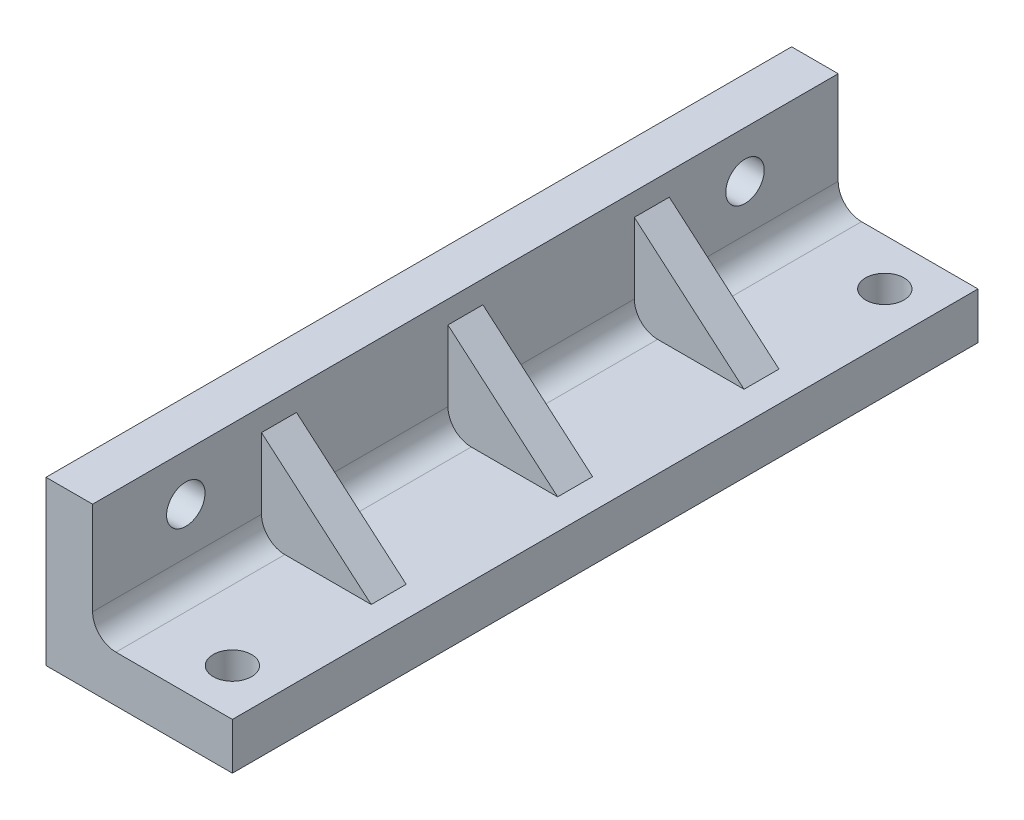
ISO-10303-21;
HEADER;
FILE_DESCRIPTION(('STEP AP214'),'2;1');
FILE_NAME('part.step','',(''),(''),'','','');
FILE_SCHEMA(('AUTOMOTIVE_DESIGN { 1 0 10303 214 1 1 1 1 }'));
ENDSEC;
DATA;
#1=APPLICATION_CONTEXT('core data for automotive mechanical design processes');
#2=APPLICATION_PROTOCOL_DEFINITION('international standard','automotive_design',2000,#1);
#3=PRODUCT_CONTEXT('',#1,'mechanical');
#4=PRODUCT('Part','Part','',(#3));
#5=PRODUCT_RELATED_PRODUCT_CATEGORY('part','',(#4));
#6=PRODUCT_DEFINITION_FORMATION('','',#4);
#7=PRODUCT_DEFINITION_CONTEXT('part definition',#1,'design');
#8=PRODUCT_DEFINITION('design','',#6,#7);
#9=PRODUCT_DEFINITION_SHAPE('','',#8);
#10=(LENGTH_UNIT() NAMED_UNIT(*) SI_UNIT(.MILLI.,.METRE.));
#11=(NAMED_UNIT(*) PLANE_ANGLE_UNIT() SI_UNIT($,.RADIAN.));
#12=(NAMED_UNIT(*) SI_UNIT($,.STERADIAN.) SOLID_ANGLE_UNIT());
#13=UNCERTAINTY_MEASURE_WITH_UNIT(LENGTH_MEASURE(1.E-05),#10,'distance_accuracy_value','');
#14=(GEOMETRIC_REPRESENTATION_CONTEXT(3) GLOBAL_UNCERTAINTY_ASSIGNED_CONTEXT((#13)) GLOBAL_UNIT_ASSIGNED_CONTEXT((#10,
#11,#12)) REPRESENTATION_CONTEXT('',''));
#15=CARTESIAN_POINT('',(0.,0.,0.));
#16=DIRECTION('',(0.,0.,1.));
#17=DIRECTION('',(1.,0.,0.));
#18=AXIS2_PLACEMENT_3D('',#15,#16,#17);
#19=CARTESIAN_POINT('',(6.,6.,32.));
#20=DIRECTION('',(0.,0.,1.));
#21=DIRECTION('',(1.,0.,0.));
#22=AXIS2_PLACEMENT_3D('',#19,#20,#21);
#23=CYLINDRICAL_SURFACE('',#22,2.);
#24=CARTESIAN_POINT('',(6.,6.,14.5));
#25=DIRECTION('',(0.,0.,1.));
#26=DIRECTION('',(1.,0.,0.));
#27=AXIS2_PLACEMENT_3D('',#24,#25,#26);
#28=CIRCLE('',#27,2.);
#29=CARTESIAN_POINT('',(6.,4.,14.5));
#30=VERTEX_POINT('',#29);
#31=CARTESIAN_POINT('',(4.,6.,14.5));
#32=VERTEX_POINT('',#31);
#33=EDGE_CURVE('E172',#30,#32,#28,.F.);
#34=ORIENTED_EDGE('',*,*,#33,.F.);
#35=DIRECTION('',(0.,0.,-1.));
#36=VECTOR('',#35,1.);
#37=CARTESIAN_POINT('',(6.,4.,32.));
#38=LINE('',#37,#36);
#39=CARTESIAN_POINT('',(6.,4.,1.5));
#40=VERTEX_POINT('',#39);
#41=EDGE_CURVE('E398',#40,#30,#38,.F.);
#42=ORIENTED_EDGE('',*,*,#41,.F.);
#43=CARTESIAN_POINT('',(6.,6.,1.5));
#44=DIRECTION('',(0.,0.,1.));
#45=DIRECTION('',(1.,0.,0.));
#46=AXIS2_PLACEMENT_3D('',#43,#44,#45);
#47=CIRCLE('',#46,2.);
#48=CARTESIAN_POINT('',(4.,6.,1.5));
#49=VERTEX_POINT('',#48);
#50=EDGE_CURVE('E174',#40,#49,#47,.F.);
#51=ORIENTED_EDGE('',*,*,#50,.T.);
#52=DIRECTION('',(0.,0.,-1.));
#53=VECTOR('',#52,1.);
#54=CARTESIAN_POINT('',(4.,6.,-32.));
#55=LINE('',#54,#53);
#56=EDGE_CURVE('E168',#32,#49,#55,.T.);
#57=ORIENTED_EDGE('',*,*,#56,.F.);
#58=EDGE_LOOP('',(#34,#42,#51,#57));
#59=FACE_BOUND('',#58,.T.);
#60=ADVANCED_FACE('F39',(#59),#23,.F.);
#61=CARTESIAN_POINT('',(6.,6.,-1.5));
#62=DIRECTION('',(0.,0.,1.));
#63=DIRECTION('',(1.,0.,0.));
#64=AXIS2_PLACEMENT_3D('',#61,#62,#63);
#65=CIRCLE('',#64,2.);
#66=CARTESIAN_POINT('',(6.,4.,-1.5));
#67=VERTEX_POINT('',#66);
#68=CARTESIAN_POINT('',(4.,6.,-1.5));
#69=VERTEX_POINT('',#68);
#70=EDGE_CURVE('E196',#67,#69,#65,.F.);
#71=ORIENTED_EDGE('',*,*,#70,.F.);
#72=CARTESIAN_POINT('',(6.,4.,-14.5));
#73=VERTEX_POINT('',#72);
#74=EDGE_CURVE('E214',#73,#67,#38,.F.);
#75=ORIENTED_EDGE('',*,*,#74,.F.);
#76=CARTESIAN_POINT('',(6.,6.,-14.5));
#77=DIRECTION('',(0.,0.,1.));
#78=DIRECTION('',(1.,0.,0.));
#79=AXIS2_PLACEMENT_3D('',#76,#77,#78);
#80=CIRCLE('',#79,2.);
#81=CARTESIAN_POINT('',(4.,6.,-14.5));
#82=VERTEX_POINT('',#81);
#83=EDGE_CURVE('E202',#73,#82,#80,.F.);
#84=ORIENTED_EDGE('',*,*,#83,.T.);
#85=EDGE_CURVE('E178',#69,#82,#55,.T.);
#86=ORIENTED_EDGE('',*,*,#85,.F.);
#87=EDGE_LOOP('',(#71,#75,#84,#86));
#88=FACE_BOUND('',#87,.T.);
#89=ADVANCED_FACE('F353',(#88),#23,.F.);
#90=CARTESIAN_POINT('',(6.,6.,-17.5));
#91=DIRECTION('',(0.,0.,1.));
#92=DIRECTION('',(1.,0.,0.));
#93=AXIS2_PLACEMENT_3D('',#90,#91,#92);
#94=CIRCLE('',#93,2.);
#95=CARTESIAN_POINT('',(6.,4.,-17.5));
#96=VERTEX_POINT('',#95);
#97=CARTESIAN_POINT('',(4.,6.,-17.5));
#98=VERTEX_POINT('',#97);
#99=EDGE_CURVE('E205',#96,#98,#94,.F.);
#100=ORIENTED_EDGE('',*,*,#99,.F.);
#101=CARTESIAN_POINT('',(6.,4.,-32.));
#102=VERTEX_POINT('',#101);
#103=EDGE_CURVE('E212',#102,#96,#38,.F.);
#104=ORIENTED_EDGE('',*,*,#103,.F.);
#105=CARTESIAN_POINT('',(6.,6.,-32.));
#106=DIRECTION('',(0.,0.,1.));
#107=DIRECTION('',(1.,0.,0.));
#108=AXIS2_PLACEMENT_3D('',#105,#106,#107);
#109=CIRCLE('',#108,2.);
#110=CARTESIAN_POINT('',(4.,6.,-32.));
#111=VERTEX_POINT('',#110);
#112=EDGE_CURVE('E210',#111,#102,#109,.T.);
#113=ORIENTED_EDGE('',*,*,#112,.F.);
#114=EDGE_CURVE('E217',#98,#111,#55,.T.);
#115=ORIENTED_EDGE('',*,*,#114,.F.);
#116=EDGE_LOOP('',(#100,#104,#113,#115));
#117=FACE_BOUND('',#116,.T.);
#118=ADVANCED_FACE('F357',(#117),#23,.F.);
#119=CARTESIAN_POINT('',(0.,14.,32.));
#120=DIRECTION('',(1.,0.,0.));
#121=DIRECTION('',(0.,0.,-1.));
#122=AXIS2_PLACEMENT_3D('',#119,#120,#121);
#123=PLANE('',#122);
#124=CARTESIAN_POINT('',(0.,10.,24.));
#125=DIRECTION('',(1.,0.,0.));
#126=DIRECTION('',(0.,0.,-1.));
#127=AXIS2_PLACEMENT_3D('',#124,#125,#126);
#128=CIRCLE('',#127,1.65);
#129=CARTESIAN_POINT('',(0.,10.,22.35));
#130=VERTEX_POINT('',#129);
#131=EDGE_CURVE('E226',#130,#130,#128,.T.);
#132=ORIENTED_EDGE('',*,*,#131,.T.);
#133=EDGE_LOOP('',(#132));
#134=FACE_BOUND('',#133,.T.);
#135=CARTESIAN_POINT('',(0.,10.,-24.));
#136=DIRECTION('',(1.,0.,0.));
#137=DIRECTION('',(0.,0.,-1.));
#138=AXIS2_PLACEMENT_3D('',#135,#136,#137);
#139=CIRCLE('',#138,1.65);
#140=CARTESIAN_POINT('',(0.,10.,-25.65));
#141=VERTEX_POINT('',#140);
#142=EDGE_CURVE('E234',#141,#141,#139,.T.);
#143=ORIENTED_EDGE('',*,*,#142,.T.);
#144=EDGE_LOOP('',(#143));
#145=FACE_BOUND('',#144,.T.);
#146=DIRECTION('',(0.,-1.,0.));
#147=VECTOR('',#146,1.);
#148=CARTESIAN_POINT('',(0.,14.,-32.));
#149=LINE('',#148,#147);
#150=CARTESIAN_POINT('',(0.,14.,-32.));
#151=VERTEX_POINT('',#150);
#152=CARTESIAN_POINT('',(0.,0.,-32.));
#153=VERTEX_POINT('',#152);
#154=EDGE_CURVE('E263',#151,#153,#149,.T.);
#155=ORIENTED_EDGE('',*,*,#154,.T.);
#156=DIRECTION('',(0.,0.,-1.));
#157=VECTOR('',#156,1.);
#158=CARTESIAN_POINT('',(0.,0.,32.));
#159=LINE('',#158,#157);
#160=CARTESIAN_POINT('',(0.,0.,32.));
#161=VERTEX_POINT('',#160);
#162=EDGE_CURVE('E235',#161,#153,#159,.T.);
#163=ORIENTED_EDGE('',*,*,#162,.F.);
#164=DIRECTION('',(0.,-1.,0.));
#165=VECTOR('',#164,1.);
#166=CARTESIAN_POINT('',(0.,14.,32.));
#167=LINE('',#166,#165);
#168=CARTESIAN_POINT('',(0.,14.,32.));
#169=VERTEX_POINT('',#168);
#170=EDGE_CURVE('E253',#169,#161,#167,.T.);
#171=ORIENTED_EDGE('',*,*,#170,.F.);
#172=DIRECTION('',(0.,0.,-1.));
#173=VECTOR('',#172,1.);
#174=CARTESIAN_POINT('',(0.,14.,32.));
#175=LINE('',#174,#173);
#176=EDGE_CURVE('E247',#169,#151,#175,.T.);
#177=ORIENTED_EDGE('',*,*,#176,.T.);
#178=EDGE_LOOP('',(#155,#163,#171,#177));
#179=FACE_BOUND('',#178,.T.);
#180=ADVANCED_FACE('F375',(#134,#145,#179),#123,.F.);
#181=CARTESIAN_POINT('',(0.,0.,32.));
#182=DIRECTION('',(0.,1.,0.));
#183=DIRECTION('',(0.,0.,1.));
#184=AXIS2_PLACEMENT_3D('',#181,#182,#183);
#185=PLANE('',#184);
#186=CARTESIAN_POINT('',(12.,0.,28.));
#187=DIRECTION('',(0.,1.,0.));
#188=DIRECTION('',(0.,0.,1.));
#189=AXIS2_PLACEMENT_3D('',#186,#187,#188);
#190=CIRCLE('',#189,1.65);
#191=CARTESIAN_POINT('',(12.,0.,29.65));
#192=VERTEX_POINT('',#191);
#193=EDGE_CURVE('E221',#192,#192,#190,.T.);
#194=ORIENTED_EDGE('',*,*,#193,.T.);
#195=EDGE_LOOP('',(#194));
#196=FACE_BOUND('',#195,.T.);
#197=CARTESIAN_POINT('',(12.,0.,-28.));
#198=DIRECTION('',(0.,1.,0.));
#199=DIRECTION('',(0.,0.,1.));
#200=AXIS2_PLACEMENT_3D('',#197,#198,#199);
#201=CIRCLE('',#200,1.65);
#202=CARTESIAN_POINT('',(12.,0.,-26.35));
#203=VERTEX_POINT('',#202);
#204=EDGE_CURVE('E230',#203,#203,#201,.T.);
#205=ORIENTED_EDGE('',*,*,#204,.T.);
#206=EDGE_LOOP('',(#205));
#207=FACE_BOUND('',#206,.T.);
#208=DIRECTION('',(1.,0.,0.));
#209=VECTOR('',#208,1.);
#210=CARTESIAN_POINT('',(0.,0.,-32.));
#211=LINE('',#210,#209);
#212=CARTESIAN_POINT('',(16.,0.,-32.));
#213=VERTEX_POINT('',#212);
#214=EDGE_CURVE('E261',#153,#213,#211,.T.);
#215=ORIENTED_EDGE('',*,*,#214,.T.);
#216=DIRECTION('',(0.,0.,-1.));
#217=VECTOR('',#216,1.);
#218=CARTESIAN_POINT('',(16.,0.,32.));
#219=LINE('',#218,#217);
#220=CARTESIAN_POINT('',(16.,0.,32.));
#221=VERTEX_POINT('',#220);
#222=EDGE_CURVE('E238',#221,#213,#219,.T.);
#223=ORIENTED_EDGE('',*,*,#222,.F.);
#224=DIRECTION('',(1.,0.,0.));
#225=VECTOR('',#224,1.);
#226=CARTESIAN_POINT('',(0.,0.,32.));
#227=LINE('',#226,#225);
#228=EDGE_CURVE('E274',#161,#221,#227,.T.);
#229=ORIENTED_EDGE('',*,*,#228,.F.);
#230=ORIENTED_EDGE('',*,*,#162,.T.);
#231=EDGE_LOOP('',(#215,#223,#229,#230));
#232=FACE_BOUND('',#231,.T.);
#233=ADVANCED_FACE('F380',(#196,#207,#232),#185,.F.);
#234=CARTESIAN_POINT('',(16.,0.,32.));
#235=DIRECTION('',(-1.,0.,0.));
#236=DIRECTION('',(0.,0.,1.));
#237=AXIS2_PLACEMENT_3D('',#234,#235,#236);
#238=PLANE('',#237);
#239=DIRECTION('',(0.,1.,0.));
#240=VECTOR('',#239,1.);
#241=CARTESIAN_POINT('',(16.,0.,-32.));
#242=LINE('',#241,#240);
#243=CARTESIAN_POINT('',(16.,4.,-32.));
#244=VERTEX_POINT('',#243);
#245=EDGE_CURVE('E259',#213,#244,#242,.T.);
#246=ORIENTED_EDGE('',*,*,#245,.T.);
#247=DIRECTION('',(0.,0.,-1.));
#248=VECTOR('',#247,1.);
#249=CARTESIAN_POINT('',(16.,4.,32.));
#250=LINE('',#249,#248);
#251=CARTESIAN_POINT('',(16.,4.,32.));
#252=VERTEX_POINT('',#251);
#253=EDGE_CURVE('E241',#252,#244,#250,.T.);
#254=ORIENTED_EDGE('',*,*,#253,.F.);
#255=DIRECTION('',(0.,1.,0.));
#256=VECTOR('',#255,1.);
#257=CARTESIAN_POINT('',(16.,0.,32.));
#258=LINE('',#257,#256);
#259=EDGE_CURVE('E272',#221,#252,#258,.T.);
#260=ORIENTED_EDGE('',*,*,#259,.F.);
#261=ORIENTED_EDGE('',*,*,#222,.T.);
#262=EDGE_LOOP('',(#246,#254,#260,#261));
#263=FACE_BOUND('',#262,.T.);
#264=ADVANCED_FACE('F421',(#263),#238,.F.);
#265=CARTESIAN_POINT('',(16.,4.,32.));
#266=DIRECTION('',(0.,-1.,0.));
#267=DIRECTION('',(0.,0.,-1.));
#268=AXIS2_PLACEMENT_3D('',#265,#266,#267);
#269=PLANE('',#268);
#270=CARTESIAN_POINT('',(12.,4.,28.));
#271=DIRECTION('',(0.,-1.,0.));
#272=DIRECTION('',(0.,0.,-1.));
#273=AXIS2_PLACEMENT_3D('',#270,#271,#272);
#274=CIRCLE('',#273,1.65);
#275=CARTESIAN_POINT('',(12.,4.,26.35));
#276=VERTEX_POINT('',#275);
#277=EDGE_CURVE('E218',#276,#276,#274,.T.);
#278=ORIENTED_EDGE('',*,*,#277,.T.);
#279=EDGE_LOOP('',(#278));
#280=FACE_BOUND('',#279,.T.);
#281=CARTESIAN_POINT('',(12.,4.,-28.));
#282=DIRECTION('',(0.,-1.,0.));
#283=DIRECTION('',(0.,0.,-1.));
#284=AXIS2_PLACEMENT_3D('',#281,#282,#283);
#285=CIRCLE('',#284,1.65);
#286=CARTESIAN_POINT('',(12.,4.,-29.65));
#287=VERTEX_POINT('',#286);
#288=EDGE_CURVE('E227',#287,#287,#285,.T.);
#289=ORIENTED_EDGE('',*,*,#288,.T.);
#290=EDGE_LOOP('',(#289));
#291=FACE_BOUND('',#290,.T.);
#292=DIRECTION('',(0.,0.,-1.));
#293=VECTOR('',#292,1.);
#294=CARTESIAN_POINT('',(13.4166666666667,4.,32.));
#295=LINE('',#294,#293);
#296=CARTESIAN_POINT('',(13.4166666666667,4.,17.5));
#297=VERTEX_POINT('',#296);
#298=CARTESIAN_POINT('',(13.4166666666667,4.,14.5));
#299=VERTEX_POINT('',#298);
#300=EDGE_CURVE('E54',#297,#299,#295,.T.);
#301=ORIENTED_EDGE('',*,*,#300,.F.);
#302=DIRECTION('',(-1.,0.,0.));
#303=VECTOR('',#302,1.);
#304=CARTESIAN_POINT('',(16.,4.,17.5));
#305=LINE('',#304,#303);
#306=CARTESIAN_POINT('',(6.,4.,17.5));
#307=VERTEX_POINT('',#306);
#308=EDGE_CURVE('E324',#297,#307,#305,.T.);
#309=ORIENTED_EDGE('',*,*,#308,.T.);
#310=CARTESIAN_POINT('',(6.,4.,32.));
#311=VERTEX_POINT('',#310);
#312=EDGE_CURVE('E215',#307,#311,#38,.F.);
#313=ORIENTED_EDGE('',*,*,#312,.T.);
#314=DIRECTION('',(-1.,0.,0.));
#315=VECTOR('',#314,1.);
#316=CARTESIAN_POINT('',(16.,4.,32.));
#317=LINE('',#316,#315);
#318=EDGE_CURVE('E269',#252,#311,#317,.T.);
#319=ORIENTED_EDGE('',*,*,#318,.F.);
#320=ORIENTED_EDGE('',*,*,#253,.T.);
#321=DIRECTION('',(-1.,0.,0.));
#322=VECTOR('',#321,1.);
#323=CARTESIAN_POINT('',(16.,4.,-32.));
#324=LINE('',#323,#322);
#325=EDGE_CURVE('E256',#244,#102,#324,.T.);
#326=ORIENTED_EDGE('',*,*,#325,.T.);
#327=ORIENTED_EDGE('',*,*,#103,.T.);
#328=DIRECTION('',(-1.,0.,0.));
#329=VECTOR('',#328,1.);
#330=CARTESIAN_POINT('',(16.,4.,-17.5));
#331=LINE('',#330,#329);
#332=CARTESIAN_POINT('',(13.4166666666667,4.,-17.5));
#333=VERTEX_POINT('',#332);
#334=EDGE_CURVE('E292',#333,#96,#331,.T.);
#335=ORIENTED_EDGE('',*,*,#334,.F.);
#336=DIRECTION('',(0.,0.,-1.));
#337=VECTOR('',#336,1.);
#338=CARTESIAN_POINT('',(13.4166666666667,4.,32.));
#339=LINE('',#338,#337);
#340=CARTESIAN_POINT('',(13.4166666666667,4.,-14.5));
#341=VERTEX_POINT('',#340);
#342=EDGE_CURVE('E222',#341,#333,#339,.T.);
#343=ORIENTED_EDGE('',*,*,#342,.F.);
#344=DIRECTION('',(-1.,0.,0.));
#345=VECTOR('',#344,1.);
#346=CARTESIAN_POINT('',(16.,4.,-14.5));
#347=LINE('',#346,#345);
#348=EDGE_CURVE('E288',#341,#73,#347,.T.);
#349=ORIENTED_EDGE('',*,*,#348,.T.);
#350=ORIENTED_EDGE('',*,*,#74,.T.);
#351=DIRECTION('',(-1.,0.,0.));
#352=VECTOR('',#351,1.);
#353=CARTESIAN_POINT('',(16.,4.,-1.5));
#354=LINE('',#353,#352);
#355=CARTESIAN_POINT('',(13.4166666666667,4.,-1.5));
#356=VERTEX_POINT('',#355);
#357=EDGE_CURVE('E311',#356,#67,#354,.T.);
#358=ORIENTED_EDGE('',*,*,#357,.F.);
#359=DIRECTION('',(0.,0.,-1.));
#360=VECTOR('',#359,1.);
#361=CARTESIAN_POINT('',(13.4166666666667,4.,32.));
#362=LINE('',#361,#360);
#363=CARTESIAN_POINT('',(13.4166666666667,4.,1.5));
#364=VERTEX_POINT('',#363);
#365=EDGE_CURVE('E302',#364,#356,#362,.T.);
#366=ORIENTED_EDGE('',*,*,#365,.F.);
#367=DIRECTION('',(-1.,0.,0.));
#368=VECTOR('',#367,1.);
#369=CARTESIAN_POINT('',(16.,4.,1.5));
#370=LINE('',#369,#368);
#371=EDGE_CURVE('E307',#364,#40,#370,.T.);
#372=ORIENTED_EDGE('',*,*,#371,.T.);
#373=ORIENTED_EDGE('',*,*,#41,.T.);
#374=DIRECTION('',(-1.,0.,0.));
#375=VECTOR('',#374,1.);
#376=CARTESIAN_POINT('',(16.,4.,14.5));
#377=LINE('',#376,#375);
#378=EDGE_CURVE('E59',#299,#30,#377,.T.);
#379=ORIENTED_EDGE('',*,*,#378,.F.);
#380=EDGE_LOOP('',(#301,#309,#313,#319,#320,#326,#327,#335,#343,#349,#350,#358,#366,#372,#373,#379));
#381=FACE_BOUND('',#380,.T.);
#382=ADVANCED_FACE('F386',(#280,#291,#381),#269,.F.);
#383=CARTESIAN_POINT('',(4.,4.,32.));
#384=DIRECTION('',(-1.,0.,0.));
#385=DIRECTION('',(0.,0.,1.));
#386=AXIS2_PLACEMENT_3D('',#383,#384,#385);
#387=PLANE('',#386);
#388=CARTESIAN_POINT('',(4.,10.,24.));
#389=DIRECTION('',(-1.,0.,0.));
#390=DIRECTION('',(0.,0.,1.));
#391=AXIS2_PLACEMENT_3D('',#388,#389,#390);
#392=CIRCLE('',#391,1.65);
#393=CARTESIAN_POINT('',(4.,10.,25.65));
#394=VERTEX_POINT('',#393);
#395=EDGE_CURVE('E223',#394,#394,#392,.T.);
#396=ORIENTED_EDGE('',*,*,#395,.T.);
#397=EDGE_LOOP('',(#396));
#398=FACE_BOUND('',#397,.T.);
#399=CARTESIAN_POINT('',(4.,10.,-24.));
#400=DIRECTION('',(-1.,0.,0.));
#401=DIRECTION('',(0.,0.,1.));
#402=AXIS2_PLACEMENT_3D('',#399,#400,#401);
#403=CIRCLE('',#402,1.65);
#404=CARTESIAN_POINT('',(4.,10.,-22.35));
#405=VERTEX_POINT('',#404);
#406=EDGE_CURVE('E231',#405,#405,#403,.T.);
#407=ORIENTED_EDGE('',*,*,#406,.T.);
#408=EDGE_LOOP('',(#407));
#409=FACE_BOUND('',#408,.T.);
#410=CARTESIAN_POINT('',(4.,6.,32.));
#411=VERTEX_POINT('',#410);
#412=CARTESIAN_POINT('',(4.,6.,17.5));
#413=VERTEX_POINT('',#412);
#414=EDGE_CURVE('E177',#411,#413,#55,.T.);
#415=ORIENTED_EDGE('',*,*,#414,.T.);
#416=DIRECTION('',(0.,1.,0.));
#417=VECTOR('',#416,1.);
#418=CARTESIAN_POINT('',(4.,4.,17.5));
#419=LINE('',#418,#417);
#420=CARTESIAN_POINT('',(4.,12.0714285714286,17.5));
#421=VERTEX_POINT('',#420);
#422=EDGE_CURVE('E326',#413,#421,#419,.T.);
#423=ORIENTED_EDGE('',*,*,#422,.T.);
#424=DIRECTION('',(0.,0.,1.));
#425=VECTOR('',#424,1.);
#426=CARTESIAN_POINT('',(4.,12.0714285714286,32.));
#427=LINE('',#426,#425);
#428=CARTESIAN_POINT('',(4.,12.0714285714286,14.5));
#429=VERTEX_POINT('',#428);
#430=EDGE_CURVE('E11',#429,#421,#427,.T.);
#431=ORIENTED_EDGE('',*,*,#430,.F.);
#432=DIRECTION('',(0.,1.,0.));
#433=VECTOR('',#432,1.);
#434=CARTESIAN_POINT('',(4.,4.,14.5));
#435=LINE('',#434,#433);
#436=EDGE_CURVE('E181',#32,#429,#435,.T.);
#437=ORIENTED_EDGE('',*,*,#436,.F.);
#438=ORIENTED_EDGE('',*,*,#56,.T.);
#439=DIRECTION('',(0.,1.,0.));
#440=VECTOR('',#439,1.);
#441=CARTESIAN_POINT('',(4.,4.,1.5));
#442=LINE('',#441,#440);
#443=CARTESIAN_POINT('',(4.,12.0714285714286,1.5));
#444=VERTEX_POINT('',#443);
#445=EDGE_CURVE('E309',#49,#444,#442,.T.);
#446=ORIENTED_EDGE('',*,*,#445,.T.);
#447=DIRECTION('',(0.,0.,1.));
#448=VECTOR('',#447,1.);
#449=CARTESIAN_POINT('',(4.,12.0714285714286,32.));
#450=LINE('',#449,#448);
#451=CARTESIAN_POINT('',(4.,12.0714285714286,-1.5));
#452=VERTEX_POINT('',#451);
#453=EDGE_CURVE('E190',#452,#444,#450,.T.);
#454=ORIENTED_EDGE('',*,*,#453,.F.);
#455=DIRECTION('',(0.,1.,0.));
#456=VECTOR('',#455,1.);
#457=CARTESIAN_POINT('',(4.,4.,-1.5));
#458=LINE('',#457,#456);
#459=EDGE_CURVE('E314',#69,#452,#458,.T.);
#460=ORIENTED_EDGE('',*,*,#459,.F.);
#461=ORIENTED_EDGE('',*,*,#85,.T.);
#462=DIRECTION('',(0.,1.,0.));
#463=VECTOR('',#462,1.);
#464=CARTESIAN_POINT('',(4.,4.,-14.5));
#465=LINE('',#464,#463);
#466=CARTESIAN_POINT('',(4.,12.0714285714286,-14.5));
#467=VERTEX_POINT('',#466);
#468=EDGE_CURVE('E290',#82,#467,#465,.T.);
#469=ORIENTED_EDGE('',*,*,#468,.T.);
#470=DIRECTION('',(0.,0.,1.));
#471=VECTOR('',#470,1.);
#472=CARTESIAN_POINT('',(4.,12.0714285714286,32.));
#473=LINE('',#472,#471);
#474=CARTESIAN_POINT('',(4.,12.0714285714286,-17.5));
#475=VERTEX_POINT('',#474);
#476=EDGE_CURVE('E199',#475,#467,#473,.T.);
#477=ORIENTED_EDGE('',*,*,#476,.F.);
#478=DIRECTION('',(0.,1.,0.));
#479=VECTOR('',#478,1.);
#480=CARTESIAN_POINT('',(4.,4.,-17.5));
#481=LINE('',#480,#479);
#482=EDGE_CURVE('E295',#98,#475,#481,.T.);
#483=ORIENTED_EDGE('',*,*,#482,.F.);
#484=ORIENTED_EDGE('',*,*,#114,.T.);
#485=DIRECTION('',(0.,1.,0.));
#486=VECTOR('',#485,1.);
#487=CARTESIAN_POINT('',(4.,4.,-32.));
#488=LINE('',#487,#486);
#489=CARTESIAN_POINT('',(4.,14.,-32.));
#490=VERTEX_POINT('',#489);
#491=EDGE_CURVE('E254',#111,#490,#488,.T.);
#492=ORIENTED_EDGE('',*,*,#491,.T.);
#493=DIRECTION('',(0.,0.,-1.));
#494=VECTOR('',#493,1.);
#495=CARTESIAN_POINT('',(4.,14.,32.));
#496=LINE('',#495,#494);
#497=CARTESIAN_POINT('',(4.,14.,32.));
#498=VERTEX_POINT('',#497);
#499=EDGE_CURVE('E244',#498,#490,#496,.T.);
#500=ORIENTED_EDGE('',*,*,#499,.F.);
#501=DIRECTION('',(0.,1.,0.));
#502=VECTOR('',#501,1.);
#503=CARTESIAN_POINT('',(4.,4.,32.));
#504=LINE('',#503,#502);
#505=EDGE_CURVE('E267',#411,#498,#504,.T.);
#506=ORIENTED_EDGE('',*,*,#505,.F.);
#507=EDGE_LOOP('',(#415,#423,#431,#437,#438,#446,#454,#460,#461,#469,#477,#483,#484,#492,#500,#506));
#508=FACE_BOUND('',#507,.T.);
#509=ADVANCED_FACE('F183',(#398,#409,#508),#387,.F.);
#510=CARTESIAN_POINT('',(4.,14.,32.));
#511=DIRECTION('',(0.,-1.,0.));
#512=DIRECTION('',(0.,0.,-1.));
#513=AXIS2_PLACEMENT_3D('',#510,#511,#512);
#514=PLANE('',#513);
#515=DIRECTION('',(-1.,0.,0.));
#516=VECTOR('',#515,1.);
#517=CARTESIAN_POINT('',(4.,14.,-32.));
#518=LINE('',#517,#516);
#519=EDGE_CURVE('E251',#490,#151,#518,.T.);
#520=ORIENTED_EDGE('',*,*,#519,.T.);
#521=ORIENTED_EDGE('',*,*,#176,.F.);
#522=DIRECTION('',(-1.,0.,0.));
#523=VECTOR('',#522,1.);
#524=CARTESIAN_POINT('',(4.,14.,32.));
#525=LINE('',#524,#523);
#526=EDGE_CURVE('E250',#498,#169,#525,.T.);
#527=ORIENTED_EDGE('',*,*,#526,.F.);
#528=ORIENTED_EDGE('',*,*,#499,.T.);
#529=EDGE_LOOP('',(#520,#521,#527,#528));
#530=FACE_BOUND('',#529,.T.);
#531=ADVANCED_FACE('F413',(#530),#514,.F.);
#532=CARTESIAN_POINT('',(0.,0.,32.));
#533=DIRECTION('',(0.,0.,1.));
#534=DIRECTION('',(1.,0.,0.));
#535=AXIS2_PLACEMENT_3D('',#532,#533,#534);
#536=PLANE('',#535);
#537=ORIENTED_EDGE('',*,*,#170,.T.);
#538=ORIENTED_EDGE('',*,*,#228,.T.);
#539=ORIENTED_EDGE('',*,*,#259,.T.);
#540=ORIENTED_EDGE('',*,*,#318,.T.);
#541=CARTESIAN_POINT('',(6.,6.,32.));
#542=DIRECTION('',(0.,0.,1.));
#543=DIRECTION('',(1.,0.,0.));
#544=AXIS2_PLACEMENT_3D('',#541,#542,#543);
#545=CIRCLE('',#544,2.);
#546=EDGE_CURVE('E208',#311,#411,#545,.F.);
#547=ORIENTED_EDGE('',*,*,#546,.T.);
#548=ORIENTED_EDGE('',*,*,#505,.T.);
#549=ORIENTED_EDGE('',*,*,#526,.T.);
#550=EDGE_LOOP('',(#537,#538,#539,#540,#547,#548,#549));
#551=FACE_BOUND('',#550,.T.);
#552=ADVANCED_FACE('F402',(#551),#536,.T.);
#553=CARTESIAN_POINT('',(0.,0.,-32.));
#554=DIRECTION('',(0.,0.,1.));
#555=DIRECTION('',(1.,0.,0.));
#556=AXIS2_PLACEMENT_3D('',#553,#554,#555);
#557=PLANE('',#556);
#558=ORIENTED_EDGE('',*,*,#154,.F.);
#559=ORIENTED_EDGE('',*,*,#519,.F.);
#560=ORIENTED_EDGE('',*,*,#491,.F.);
#561=ORIENTED_EDGE('',*,*,#112,.T.);
#562=ORIENTED_EDGE('',*,*,#325,.F.);
#563=ORIENTED_EDGE('',*,*,#245,.F.);
#564=ORIENTED_EDGE('',*,*,#214,.F.);
#565=EDGE_LOOP('',(#558,#559,#560,#561,#562,#563,#564));
#566=FACE_BOUND('',#565,.T.);
#567=ADVANCED_FACE('F423',(#566),#557,.F.);
#568=CARTESIAN_POINT('',(-100.,10.,-24.));
#569=DIRECTION('',(1.,0.,0.));
#570=DIRECTION('',(0.,0.,-1.));
#571=AXIS2_PLACEMENT_3D('',#568,#569,#570);
#572=CYLINDRICAL_SURFACE('',#571,1.65);
#573=ORIENTED_EDGE('',*,*,#406,.F.);
#574=EDGE_LOOP('',(#573));
#575=FACE_BOUND('',#574,.T.);
#576=ORIENTED_EDGE('',*,*,#142,.F.);
#577=EDGE_LOOP('',(#576));
#578=FACE_BOUND('',#577,.T.);
#579=ADVANCED_FACE('F447',(#575,#578),#572,.F.);
#580=CARTESIAN_POINT('',(12.,-100.,-28.));
#581=DIRECTION('',(0.,1.,0.));
#582=DIRECTION('',(0.,0.,1.));
#583=AXIS2_PLACEMENT_3D('',#580,#581,#582);
#584=CYLINDRICAL_SURFACE('',#583,1.65);
#585=ORIENTED_EDGE('',*,*,#288,.F.);
#586=EDGE_LOOP('',(#585));
#587=FACE_BOUND('',#586,.T.);
#588=ORIENTED_EDGE('',*,*,#204,.F.);
#589=EDGE_LOOP('',(#588));
#590=FACE_BOUND('',#589,.T.);
#591=ADVANCED_FACE('F443',(#587,#590),#584,.F.);
#592=CARTESIAN_POINT('',(-100.,10.,24.));
#593=DIRECTION('',(1.,0.,0.));
#594=DIRECTION('',(0.,0.,-1.));
#595=AXIS2_PLACEMENT_3D('',#592,#593,#594);
#596=CYLINDRICAL_SURFACE('',#595,1.65);
#597=ORIENTED_EDGE('',*,*,#395,.F.);
#598=EDGE_LOOP('',(#597));
#599=FACE_BOUND('',#598,.T.);
#600=ORIENTED_EDGE('',*,*,#131,.F.);
#601=EDGE_LOOP('',(#600));
#602=FACE_BOUND('',#601,.T.);
#603=ADVANCED_FACE('F370',(#599,#602),#596,.F.);
#604=CARTESIAN_POINT('',(12.,-100.,28.));
#605=DIRECTION('',(0.,1.,0.));
#606=DIRECTION('',(0.,0.,1.));
#607=AXIS2_PLACEMENT_3D('',#604,#605,#606);
#608=CYLINDRICAL_SURFACE('',#607,1.65);
#609=ORIENTED_EDGE('',*,*,#277,.F.);
#610=EDGE_LOOP('',(#609));
#611=FACE_BOUND('',#610,.T.);
#612=ORIENTED_EDGE('',*,*,#193,.F.);
#613=EDGE_LOOP('',(#612));
#614=FACE_BOUND('',#613,.T.);
#615=ADVANCED_FACE('F361',(#611,#614),#608,.F.);
#616=ORIENTED_EDGE('',*,*,#312,.F.);
#617=CARTESIAN_POINT('',(6.,6.,17.5));
#618=DIRECTION('',(0.,0.,1.));
#619=DIRECTION('',(1.,0.,0.));
#620=AXIS2_PLACEMENT_3D('',#617,#618,#619);
#621=CIRCLE('',#620,2.);
#622=EDGE_CURVE('E47',#307,#413,#621,.F.);
#623=ORIENTED_EDGE('',*,*,#622,.T.);
#624=ORIENTED_EDGE('',*,*,#414,.F.);
#625=ORIENTED_EDGE('',*,*,#546,.F.);
#626=EDGE_LOOP('',(#616,#623,#624,#625));
#627=FACE_BOUND('',#626,.T.);
#628=ADVANCED_FACE('F41',(#627),#23,.F.);
#629=CARTESIAN_POINT('',(14.,3.5,-14.5));
#630=DIRECTION('',(-0.650791373455968,-0.759256602365296,0.));
#631=DIRECTION('',(0.759256602365297,-0.650791373455968,0.));
#632=AXIS2_PLACEMENT_3D('',#629,#630,#631);
#633=PLANE('',#632);
#634=DIRECTION('',(-0.759256602365297,0.650791373455969,0.));
#635=VECTOR('',#634,1.);
#636=CARTESIAN_POINT('',(14.,3.5,-14.5));
#637=LINE('',#636,#635);
#638=EDGE_CURVE('E298',#341,#467,#637,.T.);
#639=ORIENTED_EDGE('',*,*,#638,.F.);
#640=ORIENTED_EDGE('',*,*,#342,.T.);
#641=DIRECTION('',(-0.759256602365297,0.650791373455969,0.));
#642=VECTOR('',#641,1.);
#643=CARTESIAN_POINT('',(14.,3.5,-17.5));
#644=LINE('',#643,#642);
#645=EDGE_CURVE('E299',#333,#475,#644,.T.);
#646=ORIENTED_EDGE('',*,*,#645,.T.);
#647=ORIENTED_EDGE('',*,*,#476,.T.);
#648=EDGE_LOOP('',(#639,#640,#646,#647));
#649=FACE_BOUND('',#648,.T.);
#650=ADVANCED_FACE('F360',(#649),#633,.F.);
#651=CARTESIAN_POINT('',(0.,0.,-14.5));
#652=DIRECTION('',(0.,0.,1.));
#653=DIRECTION('',(1.,0.,0.));
#654=AXIS2_PLACEMENT_3D('',#651,#652,#653);
#655=PLANE('',#654);
#656=ORIENTED_EDGE('',*,*,#348,.F.);
#657=ORIENTED_EDGE('',*,*,#638,.T.);
#658=ORIENTED_EDGE('',*,*,#468,.F.);
#659=ORIENTED_EDGE('',*,*,#83,.F.);
#660=EDGE_LOOP('',(#656,#657,#658,#659));
#661=FACE_BOUND('',#660,.T.);
#662=ADVANCED_FACE('F367',(#661),#655,.T.);
#663=CARTESIAN_POINT('',(0.,0.,-17.5));
#664=DIRECTION('',(0.,0.,1.));
#665=DIRECTION('',(1.,0.,0.));
#666=AXIS2_PLACEMENT_3D('',#663,#664,#665);
#667=PLANE('',#666);
#668=ORIENTED_EDGE('',*,*,#645,.F.);
#669=ORIENTED_EDGE('',*,*,#334,.T.);
#670=ORIENTED_EDGE('',*,*,#99,.T.);
#671=ORIENTED_EDGE('',*,*,#482,.T.);
#672=EDGE_LOOP('',(#668,#669,#670,#671));
#673=FACE_BOUND('',#672,.T.);
#674=ADVANCED_FACE('F389',(#673),#667,.F.);
#675=CARTESIAN_POINT('',(14.,3.5,1.5));
#676=DIRECTION('',(-0.650791373455968,-0.759256602365296,0.));
#677=DIRECTION('',(0.759256602365297,-0.650791373455968,0.));
#678=AXIS2_PLACEMENT_3D('',#675,#676,#677);
#679=PLANE('',#678);
#680=DIRECTION('',(-0.759256602365297,0.650791373455969,0.));
#681=VECTOR('',#680,1.);
#682=CARTESIAN_POINT('',(14.,3.5,1.5));
#683=LINE('',#682,#681);
#684=EDGE_CURVE('E317',#364,#444,#683,.T.);
#685=ORIENTED_EDGE('',*,*,#684,.F.);
#686=ORIENTED_EDGE('',*,*,#365,.T.);
#687=DIRECTION('',(-0.759256602365297,0.650791373455969,0.));
#688=VECTOR('',#687,1.);
#689=CARTESIAN_POINT('',(14.,3.5,-1.5));
#690=LINE('',#689,#688);
#691=EDGE_CURVE('E318',#356,#452,#690,.T.);
#692=ORIENTED_EDGE('',*,*,#691,.T.);
#693=ORIENTED_EDGE('',*,*,#453,.T.);
#694=EDGE_LOOP('',(#685,#686,#692,#693));
#695=FACE_BOUND('',#694,.T.);
#696=ADVANCED_FACE('F429',(#695),#679,.F.);
#697=CARTESIAN_POINT('',(0.,0.,1.5));
#698=DIRECTION('',(0.,0.,1.));
#699=DIRECTION('',(1.,0.,0.));
#700=AXIS2_PLACEMENT_3D('',#697,#698,#699);
#701=PLANE('',#700);
#702=ORIENTED_EDGE('',*,*,#371,.F.);
#703=ORIENTED_EDGE('',*,*,#684,.T.);
#704=ORIENTED_EDGE('',*,*,#445,.F.);
#705=ORIENTED_EDGE('',*,*,#50,.F.);
#706=EDGE_LOOP('',(#702,#703,#704,#705));
#707=FACE_BOUND('',#706,.T.);
#708=ADVANCED_FACE('F347',(#707),#701,.T.);
#709=CARTESIAN_POINT('',(0.,0.,-1.5));
#710=DIRECTION('',(0.,0.,1.));
#711=DIRECTION('',(1.,0.,0.));
#712=AXIS2_PLACEMENT_3D('',#709,#710,#711);
#713=PLANE('',#712);
#714=ORIENTED_EDGE('',*,*,#691,.F.);
#715=ORIENTED_EDGE('',*,*,#357,.T.);
#716=ORIENTED_EDGE('',*,*,#70,.T.);
#717=ORIENTED_EDGE('',*,*,#459,.T.);
#718=EDGE_LOOP('',(#714,#715,#716,#717));
#719=FACE_BOUND('',#718,.T.);
#720=ADVANCED_FACE('F340',(#719),#713,.F.);
#721=CARTESIAN_POINT('',(14.,3.5,17.5));
#722=DIRECTION('',(-0.650791373455968,-0.759256602365296,0.));
#723=DIRECTION('',(0.759256602365297,-0.650791373455968,0.));
#724=AXIS2_PLACEMENT_3D('',#721,#722,#723);
#725=PLANE('',#724);
#726=DIRECTION('',(-0.759256602365297,0.650791373455969,0.));
#727=VECTOR('',#726,1.);
#728=CARTESIAN_POINT('',(14.,3.5,17.5));
#729=LINE('',#728,#727);
#730=EDGE_CURVE('E187',#297,#421,#729,.T.);
#731=ORIENTED_EDGE('',*,*,#730,.F.);
#732=ORIENTED_EDGE('',*,*,#300,.T.);
#733=DIRECTION('',(-0.759256602365297,0.650791373455969,0.));
#734=VECTOR('',#733,1.);
#735=CARTESIAN_POINT('',(14.,3.5,14.5));
#736=LINE('',#735,#734);
#737=EDGE_CURVE('E329',#299,#429,#736,.T.);
#738=ORIENTED_EDGE('',*,*,#737,.T.);
#739=ORIENTED_EDGE('',*,*,#430,.T.);
#740=EDGE_LOOP('',(#731,#732,#738,#739));
#741=FACE_BOUND('',#740,.T.);
#742=ADVANCED_FACE('F338',(#741),#725,.F.);
#743=CARTESIAN_POINT('',(0.,0.,17.5));
#744=DIRECTION('',(0.,0.,1.));
#745=DIRECTION('',(1.,0.,0.));
#746=AXIS2_PLACEMENT_3D('',#743,#744,#745);
#747=PLANE('',#746);
#748=ORIENTED_EDGE('',*,*,#308,.F.);
#749=ORIENTED_EDGE('',*,*,#730,.T.);
#750=ORIENTED_EDGE('',*,*,#422,.F.);
#751=ORIENTED_EDGE('',*,*,#622,.F.);
#752=EDGE_LOOP('',(#748,#749,#750,#751));
#753=FACE_BOUND('',#752,.T.);
#754=ADVANCED_FACE('F335',(#753),#747,.T.);
#755=CARTESIAN_POINT('',(0.,0.,14.5));
#756=DIRECTION('',(0.,0.,1.));
#757=DIRECTION('',(1.,0.,0.));
#758=AXIS2_PLACEMENT_3D('',#755,#756,#757);
#759=PLANE('',#758);
#760=ORIENTED_EDGE('',*,*,#737,.F.);
#761=ORIENTED_EDGE('',*,*,#378,.T.);
#762=ORIENTED_EDGE('',*,*,#33,.T.);
#763=ORIENTED_EDGE('',*,*,#436,.T.);
#764=EDGE_LOOP('',(#760,#761,#762,#763));
#765=FACE_BOUND('',#764,.T.);
#766=ADVANCED_FACE('F189',(#765),#759,.F.);
#767=CLOSED_SHELL('',(#60,#89,#118,#180,#233,#264,#382,#509,#531,#552,#567,#579,#591,#603,#615,
#628,#650,#662,#674,#696,#708,#720,#742,#754,#766));
#768=MANIFOLD_SOLID_BREP('B2',#767);
#769=ADVANCED_BREP_SHAPE_REPRESENTATION('',(#18,#768),#14);
#770=SHAPE_DEFINITION_REPRESENTATION(#9,#769);
ENDSEC;
END-ISO-10303-21;
